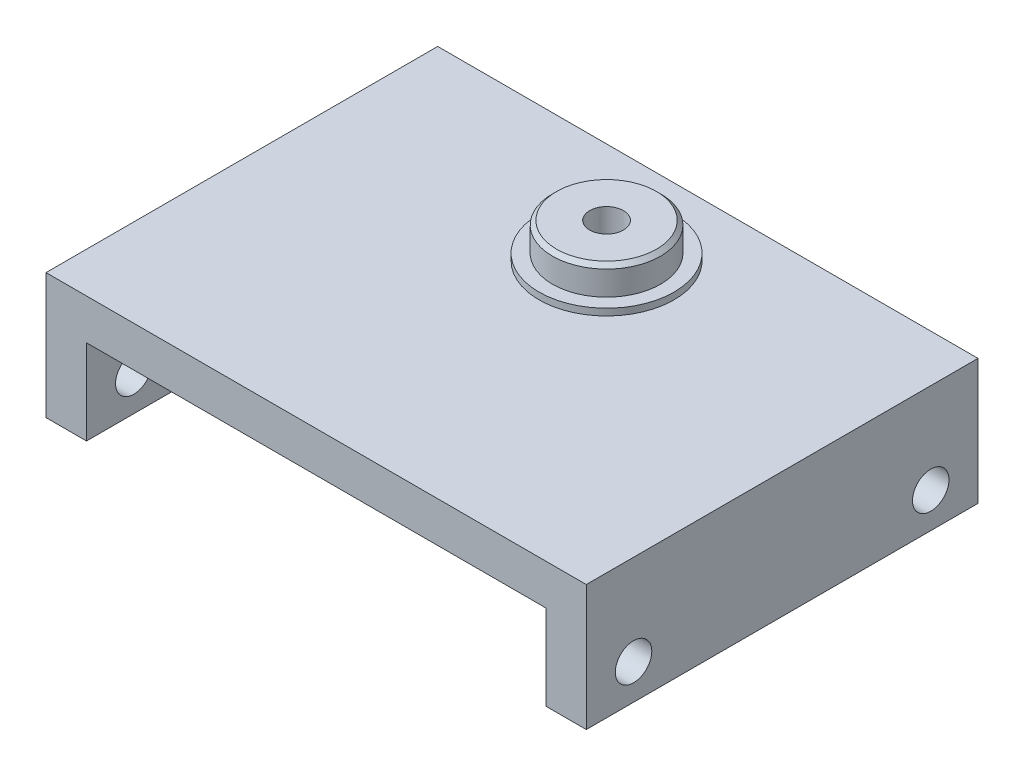
ISO-10303-21;
HEADER;
FILE_DESCRIPTION(('STEP AP214'),'2;1');
FILE_NAME('part.step','',(''),(''),'','','');
FILE_SCHEMA(('AUTOMOTIVE_DESIGN { 1 0 10303 214 1 1 1 1 }'));
ENDSEC;
DATA;
#1=APPLICATION_CONTEXT('core data for automotive mechanical design processes');
#2=APPLICATION_PROTOCOL_DEFINITION('international standard','automotive_design',2000,#1);
#3=PRODUCT_CONTEXT('',#1,'mechanical');
#4=PRODUCT('Part','Part','',(#3));
#5=PRODUCT_RELATED_PRODUCT_CATEGORY('part','',(#4));
#6=PRODUCT_DEFINITION_FORMATION('','',#4);
#7=PRODUCT_DEFINITION_CONTEXT('part definition',#1,'design');
#8=PRODUCT_DEFINITION('design','',#6,#7);
#9=PRODUCT_DEFINITION_SHAPE('','',#8);
#10=(LENGTH_UNIT() NAMED_UNIT(*) SI_UNIT(.MILLI.,.METRE.));
#11=(NAMED_UNIT(*) PLANE_ANGLE_UNIT() SI_UNIT($,.RADIAN.));
#12=(NAMED_UNIT(*) SI_UNIT($,.STERADIAN.) SOLID_ANGLE_UNIT());
#13=UNCERTAINTY_MEASURE_WITH_UNIT(LENGTH_MEASURE(1.E-05),#10,'distance_accuracy_value','');
#14=(GEOMETRIC_REPRESENTATION_CONTEXT(3) GLOBAL_UNCERTAINTY_ASSIGNED_CONTEXT((#13)) GLOBAL_UNIT_ASSIGNED_CONTEXT((#10,
#11,#12)) REPRESENTATION_CONTEXT('',''));
#15=CARTESIAN_POINT('',(0.,0.,0.));
#16=DIRECTION('',(0.,0.,1.));
#17=DIRECTION('',(1.,0.,0.));
#18=AXIS2_PLACEMENT_3D('',#15,#16,#17);
#19=CARTESIAN_POINT('',(-20.,0.,29.));
#20=DIRECTION('',(1.,0.,0.));
#21=DIRECTION('',(0.,0.,-1.));
#22=AXIS2_PLACEMENT_3D('',#19,#20,#21);
#23=PLANE('',#22);
#24=CARTESIAN_POINT('',(-20.,-6.70000000000001,25.5));
#25=DIRECTION('',(1.,0.,0.));
#26=DIRECTION('',(0.,0.,-1.));
#27=AXIS2_PLACEMENT_3D('',#24,#25,#26);
#28=CIRCLE('',#27,1.34999999999999);
#29=CARTESIAN_POINT('',(-20.,-6.70000000000001,24.15));
#30=VERTEX_POINT('',#29);
#31=EDGE_CURVE('E261',#30,#30,#28,.T.);
#32=ORIENTED_EDGE('',*,*,#31,.T.);
#33=EDGE_LOOP('',(#32));
#34=FACE_BOUND('',#33,.T.);
#35=CARTESIAN_POINT('',(-20.,-6.70000000000001,3.5));
#36=DIRECTION('',(1.,0.,0.));
#37=DIRECTION('',(0.,0.,-1.));
#38=AXIS2_PLACEMENT_3D('',#35,#36,#37);
#39=CIRCLE('',#38,1.34999999999999);
#40=CARTESIAN_POINT('',(-20.,-6.70000000000001,2.15000000000001));
#41=VERTEX_POINT('',#40);
#42=EDGE_CURVE('E272',#41,#41,#39,.T.);
#43=ORIENTED_EDGE('',*,*,#42,.T.);
#44=EDGE_LOOP('',(#43));
#45=FACE_BOUND('',#44,.T.);
#46=DIRECTION('',(0.,-1.,0.));
#47=VECTOR('',#46,1.);
#48=CARTESIAN_POINT('',(-20.,0.,0.));
#49=LINE('',#48,#47);
#50=CARTESIAN_POINT('',(-20.,0.,0.));
#51=VERTEX_POINT('',#50);
#52=CARTESIAN_POINT('',(-20.,-9.30000000000001,0.));
#53=VERTEX_POINT('',#52);
#54=EDGE_CURVE('E134',#51,#53,#49,.T.);
#55=ORIENTED_EDGE('',*,*,#54,.T.);
#56=DIRECTION('',(0.,0.,-1.));
#57=VECTOR('',#56,1.);
#58=CARTESIAN_POINT('',(-20.,-9.30000000000001,29.));
#59=LINE('',#58,#57);
#60=CARTESIAN_POINT('',(-20.,-9.30000000000001,29.));
#61=VERTEX_POINT('',#60);
#62=EDGE_CURVE('E162',#61,#53,#59,.T.);
#63=ORIENTED_EDGE('',*,*,#62,.F.);
#64=DIRECTION('',(0.,-1.,0.));
#65=VECTOR('',#64,1.);
#66=CARTESIAN_POINT('',(-20.,0.,29.));
#67=LINE('',#66,#65);
#68=CARTESIAN_POINT('',(-20.,0.,29.));
#69=VERTEX_POINT('',#68);
#70=EDGE_CURVE('E149',#69,#61,#67,.T.);
#71=ORIENTED_EDGE('',*,*,#70,.F.);
#72=DIRECTION('',(0.,0.,-1.));
#73=VECTOR('',#72,1.);
#74=CARTESIAN_POINT('',(-20.,0.,29.));
#75=LINE('',#74,#73);
#76=EDGE_CURVE('E130',#69,#51,#75,.T.);
#77=ORIENTED_EDGE('',*,*,#76,.T.);
#78=EDGE_LOOP('',(#55,#63,#71,#77));
#79=FACE_BOUND('',#78,.T.);
#80=ADVANCED_FACE('F36',(#34,#45,#79),#23,.F.);
#81=CARTESIAN_POINT('',(-20.,-9.30000000000001,29.));
#82=DIRECTION('',(0.,1.,0.));
#83=DIRECTION('',(0.,0.,1.));
#84=AXIS2_PLACEMENT_3D('',#81,#82,#83);
#85=PLANE('',#84);
#86=DIRECTION('',(1.,0.,0.));
#87=VECTOR('',#86,1.);
#88=CARTESIAN_POINT('',(-20.,-9.30000000000001,0.));
#89=LINE('',#88,#87);
#90=CARTESIAN_POINT('',(-17.,-9.30000000000001,0.));
#91=VERTEX_POINT('',#90);
#92=EDGE_CURVE('E137',#53,#91,#89,.T.);
#93=ORIENTED_EDGE('',*,*,#92,.T.);
#94=DIRECTION('',(0.,0.,-1.));
#95=VECTOR('',#94,1.);
#96=CARTESIAN_POINT('',(-17.,-9.30000000000001,29.));
#97=LINE('',#96,#95);
#98=CARTESIAN_POINT('',(-17.,-9.30000000000001,29.));
#99=VERTEX_POINT('',#98);
#100=EDGE_CURVE('E159',#99,#91,#97,.T.);
#101=ORIENTED_EDGE('',*,*,#100,.F.);
#102=DIRECTION('',(1.,0.,0.));
#103=VECTOR('',#102,1.);
#104=CARTESIAN_POINT('',(-20.,-9.30000000000001,29.));
#105=LINE('',#104,#103);
#106=EDGE_CURVE('E97',#61,#99,#105,.T.);
#107=ORIENTED_EDGE('',*,*,#106,.F.);
#108=ORIENTED_EDGE('',*,*,#62,.T.);
#109=EDGE_LOOP('',(#93,#101,#107,#108));
#110=FACE_BOUND('',#109,.T.);
#111=ADVANCED_FACE('F188',(#110),#85,.F.);
#112=CARTESIAN_POINT('',(-17.,-9.30000000000001,29.));
#113=DIRECTION('',(-1.,0.,0.));
#114=DIRECTION('',(0.,0.,1.));
#115=AXIS2_PLACEMENT_3D('',#112,#113,#114);
#116=PLANE('',#115);
#117=CARTESIAN_POINT('',(-17.,-6.70000000000001,25.5));
#118=DIRECTION('',(-1.,0.,0.));
#119=DIRECTION('',(0.,0.,1.));
#120=AXIS2_PLACEMENT_3D('',#117,#118,#119);
#121=CIRCLE('',#120,1.34999999999999);
#122=CARTESIAN_POINT('',(-17.,-6.70000000000001,26.85));
#123=VERTEX_POINT('',#122);
#124=EDGE_CURVE('E263',#123,#123,#121,.T.);
#125=ORIENTED_EDGE('',*,*,#124,.T.);
#126=EDGE_LOOP('',(#125));
#127=FACE_BOUND('',#126,.T.);
#128=CARTESIAN_POINT('',(-17.,-6.70000000000001,3.5));
#129=DIRECTION('',(-1.,0.,0.));
#130=DIRECTION('',(0.,0.,1.));
#131=AXIS2_PLACEMENT_3D('',#128,#129,#130);
#132=CIRCLE('',#131,1.34999999999999);
#133=CARTESIAN_POINT('',(-17.,-6.70000000000001,4.84999999999999));
#134=VERTEX_POINT('',#133);
#135=EDGE_CURVE('E138',#134,#134,#132,.T.);
#136=ORIENTED_EDGE('',*,*,#135,.T.);
#137=EDGE_LOOP('',(#136));
#138=FACE_BOUND('',#137,.T.);
#139=DIRECTION('',(0.,1.,0.));
#140=VECTOR('',#139,1.);
#141=CARTESIAN_POINT('',(-17.,-9.30000000000001,0.));
#142=LINE('',#141,#140);
#143=CARTESIAN_POINT('',(-17.,-3.,0.));
#144=VERTEX_POINT('',#143);
#145=EDGE_CURVE('E140',#91,#144,#142,.T.);
#146=ORIENTED_EDGE('',*,*,#145,.T.);
#147=DIRECTION('',(0.,0.,-1.));
#148=VECTOR('',#147,1.);
#149=CARTESIAN_POINT('',(-17.,-3.,29.));
#150=LINE('',#149,#148);
#151=CARTESIAN_POINT('',(-17.,-3.,29.));
#152=VERTEX_POINT('',#151);
#153=EDGE_CURVE('E156',#152,#144,#150,.T.);
#154=ORIENTED_EDGE('',*,*,#153,.F.);
#155=DIRECTION('',(0.,1.,0.));
#156=VECTOR('',#155,1.);
#157=CARTESIAN_POINT('',(-17.,-9.30000000000001,29.));
#158=LINE('',#157,#156);
#159=EDGE_CURVE('E282',#99,#152,#158,.T.);
#160=ORIENTED_EDGE('',*,*,#159,.F.);
#161=ORIENTED_EDGE('',*,*,#100,.T.);
#162=EDGE_LOOP('',(#146,#154,#160,#161));
#163=FACE_BOUND('',#162,.T.);
#164=ADVANCED_FACE('F193',(#127,#138,#163),#116,.F.);
#165=CARTESIAN_POINT('',(-17.,-3.,29.));
#166=DIRECTION('',(0.,1.,0.));
#167=DIRECTION('',(0.,0.,1.));
#168=AXIS2_PLACEMENT_3D('',#165,#166,#167);
#169=PLANE('',#168);
#170=CARTESIAN_POINT('',(0.,-3.,7.5));
#171=DIRECTION('',(0.,1.,0.));
#172=DIRECTION('',(0.,0.,1.));
#173=AXIS2_PLACEMENT_3D('',#170,#171,#172);
#174=CIRCLE('',#173,1.25);
#175=CARTESIAN_POINT('',(0.,-3.,8.75));
#176=VERTEX_POINT('',#175);
#177=EDGE_CURVE('E252',#176,#176,#174,.T.);
#178=ORIENTED_EDGE('',*,*,#177,.T.);
#179=EDGE_LOOP('',(#178));
#180=FACE_BOUND('',#179,.T.);
#181=DIRECTION('',(1.,0.,0.));
#182=VECTOR('',#181,1.);
#183=CARTESIAN_POINT('',(-17.,-3.,0.));
#184=LINE('',#183,#182);
#185=CARTESIAN_POINT('',(17.,-3.,0.));
#186=VERTEX_POINT('',#185);
#187=EDGE_CURVE('E142',#144,#186,#184,.T.);
#188=ORIENTED_EDGE('',*,*,#187,.T.);
#189=DIRECTION('',(0.,0.,-1.));
#190=VECTOR('',#189,1.);
#191=CARTESIAN_POINT('',(17.,-3.,29.));
#192=LINE('',#191,#190);
#193=CARTESIAN_POINT('',(17.,-3.,29.));
#194=VERTEX_POINT('',#193);
#195=EDGE_CURVE('E153',#194,#186,#192,.T.);
#196=ORIENTED_EDGE('',*,*,#195,.F.);
#197=DIRECTION('',(1.,0.,0.));
#198=VECTOR('',#197,1.);
#199=CARTESIAN_POINT('',(-17.,-3.,29.));
#200=LINE('',#199,#198);
#201=EDGE_CURVE('E284',#152,#194,#200,.T.);
#202=ORIENTED_EDGE('',*,*,#201,.F.);
#203=ORIENTED_EDGE('',*,*,#153,.T.);
#204=EDGE_LOOP('',(#188,#196,#202,#203));
#205=FACE_BOUND('',#204,.T.);
#206=ADVANCED_FACE('F200',(#180,#205),#169,.F.);
#207=CARTESIAN_POINT('',(17.,-9.30000000000001,29.));
#208=DIRECTION('',(1.,0.,0.));
#209=DIRECTION('',(0.,0.,-1.));
#210=AXIS2_PLACEMENT_3D('',#207,#208,#209);
#211=PLANE('',#210);
#212=CARTESIAN_POINT('',(17.,-6.70000000000001,25.5));
#213=DIRECTION('',(1.,0.,0.));
#214=DIRECTION('',(0.,0.,-1.));
#215=AXIS2_PLACEMENT_3D('',#212,#213,#214);
#216=CIRCLE('',#215,1.34999999999999);
#217=CARTESIAN_POINT('',(17.,-6.70000000000001,24.15));
#218=VERTEX_POINT('',#217);
#219=EDGE_CURVE('E266',#218,#218,#216,.T.);
#220=ORIENTED_EDGE('',*,*,#219,.T.);
#221=EDGE_LOOP('',(#220));
#222=FACE_BOUND('',#221,.T.);
#223=CARTESIAN_POINT('',(17.,-6.70000000000001,3.5));
#224=DIRECTION('',(1.,0.,0.));
#225=DIRECTION('',(0.,0.,-1.));
#226=AXIS2_PLACEMENT_3D('',#223,#224,#225);
#227=CIRCLE('',#226,1.34999999999999);
#228=CARTESIAN_POINT('',(17.,-6.70000000000001,2.15000000000001));
#229=VERTEX_POINT('',#228);
#230=EDGE_CURVE('E275',#229,#229,#227,.T.);
#231=ORIENTED_EDGE('',*,*,#230,.T.);
#232=EDGE_LOOP('',(#231));
#233=FACE_BOUND('',#232,.T.);
#234=DIRECTION('',(0.,-1.,0.));
#235=VECTOR('',#234,1.);
#236=CARTESIAN_POINT('',(17.,-9.30000000000001,0.));
#237=LINE('',#236,#235);
#238=CARTESIAN_POINT('',(17.,-9.30000000000001,0.));
#239=VERTEX_POINT('',#238);
#240=EDGE_CURVE('E144',#186,#239,#237,.T.);
#241=ORIENTED_EDGE('',*,*,#240,.T.);
#242=DIRECTION('',(0.,0.,-1.));
#243=VECTOR('',#242,1.);
#244=CARTESIAN_POINT('',(17.,-9.30000000000001,29.));
#245=LINE('',#244,#243);
#246=CARTESIAN_POINT('',(17.,-9.30000000000001,29.));
#247=VERTEX_POINT('',#246);
#248=EDGE_CURVE('E125',#247,#239,#245,.T.);
#249=ORIENTED_EDGE('',*,*,#248,.F.);
#250=DIRECTION('',(0.,-1.,0.));
#251=VECTOR('',#250,1.);
#252=CARTESIAN_POINT('',(17.,-9.30000000000001,29.));
#253=LINE('',#252,#251);
#254=EDGE_CURVE('E116',#194,#247,#253,.T.);
#255=ORIENTED_EDGE('',*,*,#254,.F.);
#256=ORIENTED_EDGE('',*,*,#195,.T.);
#257=EDGE_LOOP('',(#241,#249,#255,#256));
#258=FACE_BOUND('',#257,.T.);
#259=ADVANCED_FACE('F204',(#222,#233,#258),#211,.F.);
#260=CARTESIAN_POINT('',(20.,-9.30000000000001,29.));
#261=DIRECTION('',(0.,1.,0.));
#262=DIRECTION('',(0.,0.,1.));
#263=AXIS2_PLACEMENT_3D('',#260,#261,#262);
#264=PLANE('',#263);
#265=DIRECTION('',(1.,0.,0.));
#266=VECTOR('',#265,1.);
#267=CARTESIAN_POINT('',(20.,-9.30000000000001,0.));
#268=LINE('',#267,#266);
#269=CARTESIAN_POINT('',(20.,-9.30000000000001,0.));
#270=VERTEX_POINT('',#269);
#271=EDGE_CURVE('E124',#239,#270,#268,.T.);
#272=ORIENTED_EDGE('',*,*,#271,.T.);
#273=DIRECTION('',(0.,0.,-1.));
#274=VECTOR('',#273,1.);
#275=CARTESIAN_POINT('',(20.,-9.30000000000001,29.));
#276=LINE('',#275,#274);
#277=CARTESIAN_POINT('',(20.,-9.30000000000001,29.));
#278=VERTEX_POINT('',#277);
#279=EDGE_CURVE('E121',#278,#270,#276,.T.);
#280=ORIENTED_EDGE('',*,*,#279,.F.);
#281=DIRECTION('',(1.,0.,0.));
#282=VECTOR('',#281,1.);
#283=CARTESIAN_POINT('',(20.,-9.30000000000001,29.));
#284=LINE('',#283,#282);
#285=EDGE_CURVE('E110',#247,#278,#284,.T.);
#286=ORIENTED_EDGE('',*,*,#285,.F.);
#287=ORIENTED_EDGE('',*,*,#248,.T.);
#288=EDGE_LOOP('',(#272,#280,#286,#287));
#289=FACE_BOUND('',#288,.T.);
#290=ADVANCED_FACE('F122',(#289),#264,.F.);
#291=CARTESIAN_POINT('',(20.,0.,29.));
#292=DIRECTION('',(-1.,0.,0.));
#293=DIRECTION('',(0.,0.,1.));
#294=AXIS2_PLACEMENT_3D('',#291,#292,#293);
#295=PLANE('',#294);
#296=CARTESIAN_POINT('',(20.,-6.70000000000001,25.5));
#297=DIRECTION('',(1.,0.,0.));
#298=DIRECTION('',(0.,0.,-1.));
#299=AXIS2_PLACEMENT_3D('',#296,#297,#298);
#300=CIRCLE('',#299,1.35);
#301=CARTESIAN_POINT('',(20.,-6.70000000000001,24.15));
#302=VERTEX_POINT('',#301);
#303=EDGE_CURVE('E168',#302,#302,#300,.T.);
#304=ORIENTED_EDGE('',*,*,#303,.F.);
#305=EDGE_LOOP('',(#304));
#306=FACE_BOUND('',#305,.T.);
#307=CARTESIAN_POINT('',(20.,-6.70000000000001,3.5));
#308=DIRECTION('',(1.,0.,0.));
#309=DIRECTION('',(0.,0.,-1.));
#310=AXIS2_PLACEMENT_3D('',#307,#308,#309);
#311=CIRCLE('',#310,1.35);
#312=CARTESIAN_POINT('',(20.,-6.70000000000001,2.15));
#313=VERTEX_POINT('',#312);
#314=EDGE_CURVE('E269',#313,#313,#311,.T.);
#315=ORIENTED_EDGE('',*,*,#314,.F.);
#316=EDGE_LOOP('',(#315));
#317=FACE_BOUND('',#316,.T.);
#318=DIRECTION('',(0.,1.,0.));
#319=VECTOR('',#318,1.);
#320=CARTESIAN_POINT('',(20.,0.,0.));
#321=LINE('',#320,#319);
#322=CARTESIAN_POINT('',(20.,0.,0.));
#323=VERTEX_POINT('',#322);
#324=EDGE_CURVE('E82',#270,#323,#321,.T.);
#325=ORIENTED_EDGE('',*,*,#324,.T.);
#326=DIRECTION('',(0.,0.,-1.));
#327=VECTOR('',#326,1.);
#328=CARTESIAN_POINT('',(20.,0.,29.));
#329=LINE('',#328,#327);
#330=CARTESIAN_POINT('',(20.,0.,29.));
#331=VERTEX_POINT('',#330);
#332=EDGE_CURVE('E126',#331,#323,#329,.T.);
#333=ORIENTED_EDGE('',*,*,#332,.F.);
#334=DIRECTION('',(0.,1.,0.));
#335=VECTOR('',#334,1.);
#336=CARTESIAN_POINT('',(20.,0.,29.));
#337=LINE('',#336,#335);
#338=EDGE_CURVE('E114',#278,#331,#337,.T.);
#339=ORIENTED_EDGE('',*,*,#338,.F.);
#340=ORIENTED_EDGE('',*,*,#279,.T.);
#341=EDGE_LOOP('',(#325,#333,#339,#340));
#342=FACE_BOUND('',#341,.T.);
#343=ADVANCED_FACE('F128',(#306,#317,#342),#295,.F.);
#344=CARTESIAN_POINT('',(20.,0.,29.));
#345=DIRECTION('',(0.,-1.,0.));
#346=DIRECTION('',(0.,0.,-1.));
#347=AXIS2_PLACEMENT_3D('',#344,#345,#346);
#348=PLANE('',#347);
#349=CARTESIAN_POINT('',(0.,0.,7.5));
#350=DIRECTION('',(0.,-1.,0.));
#351=DIRECTION('',(0.,0.,-1.));
#352=AXIS2_PLACEMENT_3D('',#349,#350,#351);
#353=CIRCLE('',#352,5.);
#354=CARTESIAN_POINT('',(0.,0.,2.5));
#355=VERTEX_POINT('',#354);
#356=EDGE_CURVE('E164',#355,#355,#353,.F.);
#357=ORIENTED_EDGE('',*,*,#356,.F.);
#358=EDGE_LOOP('',(#357));
#359=FACE_BOUND('',#358,.T.);
#360=DIRECTION('',(-1.,0.,0.));
#361=VECTOR('',#360,1.);
#362=CARTESIAN_POINT('',(20.,0.,0.));
#363=LINE('',#362,#361);
#364=EDGE_CURVE('E88',#323,#51,#363,.T.);
#365=ORIENTED_EDGE('',*,*,#364,.T.);
#366=ORIENTED_EDGE('',*,*,#76,.F.);
#367=DIRECTION('',(-1.,0.,0.));
#368=VECTOR('',#367,1.);
#369=CARTESIAN_POINT('',(20.,0.,29.));
#370=LINE('',#369,#368);
#371=EDGE_CURVE('E53',#331,#69,#370,.T.);
#372=ORIENTED_EDGE('',*,*,#371,.F.);
#373=ORIENTED_EDGE('',*,*,#332,.T.);
#374=EDGE_LOOP('',(#365,#366,#372,#373));
#375=FACE_BOUND('',#374,.T.);
#376=ADVANCED_FACE('F213',(#359,#375),#348,.F.);
#377=CARTESIAN_POINT('',(0.,0.,29.));
#378=DIRECTION('',(0.,0.,1.));
#379=DIRECTION('',(1.,0.,0.));
#380=AXIS2_PLACEMENT_3D('',#377,#378,#379);
#381=PLANE('',#380);
#382=ORIENTED_EDGE('',*,*,#70,.T.);
#383=ORIENTED_EDGE('',*,*,#106,.T.);
#384=ORIENTED_EDGE('',*,*,#159,.T.);
#385=ORIENTED_EDGE('',*,*,#201,.T.);
#386=ORIENTED_EDGE('',*,*,#254,.T.);
#387=ORIENTED_EDGE('',*,*,#285,.T.);
#388=ORIENTED_EDGE('',*,*,#338,.T.);
#389=ORIENTED_EDGE('',*,*,#371,.T.);
#390=EDGE_LOOP('',(#382,#383,#384,#385,#386,#387,#388,#389));
#391=FACE_BOUND('',#390,.T.);
#392=ADVANCED_FACE('F112',(#391),#381,.T.);
#393=CARTESIAN_POINT('',(0.,0.,0.));
#394=DIRECTION('',(0.,0.,1.));
#395=DIRECTION('',(1.,0.,0.));
#396=AXIS2_PLACEMENT_3D('',#393,#394,#395);
#397=PLANE('',#396);
#398=ORIENTED_EDGE('',*,*,#54,.F.);
#399=ORIENTED_EDGE('',*,*,#364,.F.);
#400=ORIENTED_EDGE('',*,*,#324,.F.);
#401=ORIENTED_EDGE('',*,*,#271,.F.);
#402=ORIENTED_EDGE('',*,*,#240,.F.);
#403=ORIENTED_EDGE('',*,*,#187,.F.);
#404=ORIENTED_EDGE('',*,*,#145,.F.);
#405=ORIENTED_EDGE('',*,*,#92,.F.);
#406=EDGE_LOOP('',(#398,#399,#400,#401,#402,#403,#404,#405));
#407=FACE_BOUND('',#406,.T.);
#408=ADVANCED_FACE('F218',(#407),#397,.F.);
#409=CARTESIAN_POINT('',(20.,-6.70000000000001,3.5));
#410=DIRECTION('',(1.,0.,0.));
#411=DIRECTION('',(0.,0.,-1.));
#412=AXIS2_PLACEMENT_3D('',#409,#410,#411);
#413=CYLINDRICAL_SURFACE('',#412,1.34999999999999);
#414=ORIENTED_EDGE('',*,*,#314,.T.);
#415=EDGE_LOOP('',(#414));
#416=FACE_BOUND('',#415,.T.);
#417=ORIENTED_EDGE('',*,*,#230,.F.);
#418=EDGE_LOOP('',(#417));
#419=FACE_BOUND('',#418,.T.);
#420=ADVANCED_FACE('F221',(#416,#419),#413,.F.);
#421=ORIENTED_EDGE('',*,*,#42,.F.);
#422=EDGE_LOOP('',(#421));
#423=FACE_BOUND('',#422,.T.);
#424=ORIENTED_EDGE('',*,*,#135,.F.);
#425=EDGE_LOOP('',(#424));
#426=FACE_BOUND('',#425,.T.);
#427=ADVANCED_FACE('F225',(#423,#426),#413,.F.);
#428=CARTESIAN_POINT('',(20.,-6.70000000000001,25.5));
#429=DIRECTION('',(1.,0.,0.));
#430=DIRECTION('',(0.,0.,-1.));
#431=AXIS2_PLACEMENT_3D('',#428,#429,#430);
#432=CYLINDRICAL_SURFACE('',#431,1.34999999999999);
#433=ORIENTED_EDGE('',*,*,#303,.T.);
#434=EDGE_LOOP('',(#433));
#435=FACE_BOUND('',#434,.T.);
#436=ORIENTED_EDGE('',*,*,#219,.F.);
#437=EDGE_LOOP('',(#436));
#438=FACE_BOUND('',#437,.T.);
#439=ADVANCED_FACE('F228',(#435,#438),#432,.F.);
#440=ORIENTED_EDGE('',*,*,#31,.F.);
#441=EDGE_LOOP('',(#440));
#442=FACE_BOUND('',#441,.T.);
#443=ORIENTED_EDGE('',*,*,#124,.F.);
#444=EDGE_LOOP('',(#443));
#445=FACE_BOUND('',#444,.T.);
#446=ADVANCED_FACE('F232',(#442,#445),#432,.F.);
#447=CARTESIAN_POINT('',(0.,0.5,7.5));
#448=DIRECTION('',(0.,-1.,0.));
#449=DIRECTION('',(0.,0.,-1.));
#450=AXIS2_PLACEMENT_3D('',#447,#448,#449);
#451=CYLINDRICAL_SURFACE('',#450,5.);
#452=CARTESIAN_POINT('',(0.,0.5,7.5));
#453=DIRECTION('',(0.,1.,0.));
#454=DIRECTION('',(0.,0.,1.));
#455=AXIS2_PLACEMENT_3D('',#452,#453,#454);
#456=CIRCLE('',#455,5.);
#457=CARTESIAN_POINT('',(0.,0.5,12.5));
#458=VERTEX_POINT('',#457);
#459=EDGE_CURVE('E169',#458,#458,#456,.T.);
#460=ORIENTED_EDGE('',*,*,#459,.F.);
#461=EDGE_LOOP('',(#460));
#462=FACE_BOUND('',#461,.T.);
#463=ORIENTED_EDGE('',*,*,#356,.T.);
#464=EDGE_LOOP('',(#463));
#465=FACE_BOUND('',#464,.T.);
#466=ADVANCED_FACE('F240',(#462,#465),#451,.T.);
#467=CARTESIAN_POINT('',(0.,0.5,7.5));
#468=DIRECTION('',(0.,1.,0.));
#469=DIRECTION('',(0.,0.,1.));
#470=AXIS2_PLACEMENT_3D('',#467,#468,#469);
#471=PLANE('',#470);
#472=CARTESIAN_POINT('',(0.,0.5,7.5));
#473=DIRECTION('',(0.,1.,0.));
#474=DIRECTION('',(0.,0.,1.));
#475=AXIS2_PLACEMENT_3D('',#472,#473,#474);
#476=CIRCLE('',#475,4.);
#477=CARTESIAN_POINT('',(0.,0.5,11.5));
#478=VERTEX_POINT('',#477);
#479=EDGE_CURVE('E165',#478,#478,#476,.T.);
#480=ORIENTED_EDGE('',*,*,#479,.F.);
#481=EDGE_LOOP('',(#480));
#482=FACE_BOUND('',#481,.T.);
#483=ORIENTED_EDGE('',*,*,#459,.T.);
#484=EDGE_LOOP('',(#483));
#485=FACE_BOUND('',#484,.T.);
#486=ADVANCED_FACE('F239',(#482,#485),#471,.T.);
#487=CARTESIAN_POINT('',(0.,2.6,7.5));
#488=DIRECTION('',(0.,1.,0.));
#489=DIRECTION('',(0.,0.,1.));
#490=AXIS2_PLACEMENT_3D('',#487,#488,#489);
#491=PLANE('',#490);
#492=CARTESIAN_POINT('',(0.,2.6,7.5));
#493=DIRECTION('',(0.,1.,0.));
#494=DIRECTION('',(0.,0.,1.));
#495=AXIS2_PLACEMENT_3D('',#492,#493,#494);
#496=CIRCLE('',#495,3.69999999999999);
#497=CARTESIAN_POINT('',(0.,2.6,11.2));
#498=VERTEX_POINT('',#497);
#499=EDGE_CURVE('E45',#498,#498,#496,.T.);
#500=ORIENTED_EDGE('',*,*,#499,.T.);
#501=EDGE_LOOP('',(#500));
#502=FACE_BOUND('',#501,.T.);
#503=CARTESIAN_POINT('',(0.,2.6,7.5));
#504=DIRECTION('',(0.,1.,0.));
#505=DIRECTION('',(0.,0.,1.));
#506=AXIS2_PLACEMENT_3D('',#503,#504,#505);
#507=CIRCLE('',#506,1.25);
#508=CARTESIAN_POINT('',(0.,2.6,8.75));
#509=VERTEX_POINT('',#508);
#510=EDGE_CURVE('E255',#509,#509,#507,.T.);
#511=ORIENTED_EDGE('',*,*,#510,.F.);
#512=EDGE_LOOP('',(#511));
#513=FACE_BOUND('',#512,.T.);
#514=ADVANCED_FACE('F174',(#502,#513),#491,.T.);
#515=CARTESIAN_POINT('',(0.,2.6,7.5));
#516=DIRECTION('',(0.,-1.,0.));
#517=DIRECTION('',(0.,0.,-1.));
#518=AXIS2_PLACEMENT_3D('',#515,#516,#517);
#519=CYLINDRICAL_SURFACE('',#518,4.);
#520=CARTESIAN_POINT('',(0.,2.3,7.5));
#521=DIRECTION('',(0.,1.,0.));
#522=DIRECTION('',(0.,0.,1.));
#523=AXIS2_PLACEMENT_3D('',#520,#521,#522);
#524=CIRCLE('',#523,4.);
#525=CARTESIAN_POINT('',(0.,2.3,11.5));
#526=VERTEX_POINT('',#525);
#527=EDGE_CURVE('E11',#526,#526,#524,.F.);
#528=ORIENTED_EDGE('',*,*,#527,.T.);
#529=EDGE_LOOP('',(#528));
#530=FACE_BOUND('',#529,.T.);
#531=ORIENTED_EDGE('',*,*,#479,.T.);
#532=EDGE_LOOP('',(#531));
#533=FACE_BOUND('',#532,.T.);
#534=ADVANCED_FACE('F183',(#530,#533),#519,.T.);
#535=CARTESIAN_POINT('',(0.,2.6,7.5));
#536=DIRECTION('',(0.,1.,0.));
#537=DIRECTION('',(0.,0.,1.));
#538=AXIS2_PLACEMENT_3D('',#535,#536,#537);
#539=CYLINDRICAL_SURFACE('',#538,1.25);
#540=ORIENTED_EDGE('',*,*,#510,.T.);
#541=EDGE_LOOP('',(#540));
#542=FACE_BOUND('',#541,.T.);
#543=ORIENTED_EDGE('',*,*,#177,.F.);
#544=EDGE_LOOP('',(#543));
#545=FACE_BOUND('',#544,.T.);
#546=ADVANCED_FACE('F178',(#542,#545),#539,.F.);
#547=CARTESIAN_POINT('',(0.,2.6,7.5));
#548=DIRECTION('',(0.,-1.,0.));
#549=DIRECTION('',(0.,0.,-1.));
#550=AXIS2_PLACEMENT_3D('',#547,#548,#549);
#551=CONICAL_SURFACE('',#550,3.69999999999999,0.785398163397457);
#552=ORIENTED_EDGE('',*,*,#527,.F.);
#553=EDGE_LOOP('',(#552));
#554=FACE_BOUND('',#553,.T.);
#555=ORIENTED_EDGE('',*,*,#499,.F.);
#556=EDGE_LOOP('',(#555));
#557=FACE_BOUND('',#556,.T.);
#558=ADVANCED_FACE('F38',(#554,#557),#551,.T.);
#559=CLOSED_SHELL('',(#80,#111,#164,#206,#259,#290,#343,#376,#392,#408,#420,#427,#439,#446,#466,
#486,#514,#534,#546,#558));
#560=MANIFOLD_SOLID_BREP('B2',#559);
#561=ADVANCED_BREP_SHAPE_REPRESENTATION('',(#18,#560),#14);
#562=SHAPE_DEFINITION_REPRESENTATION(#9,#561);
ENDSEC;
END-ISO-10303-21;
